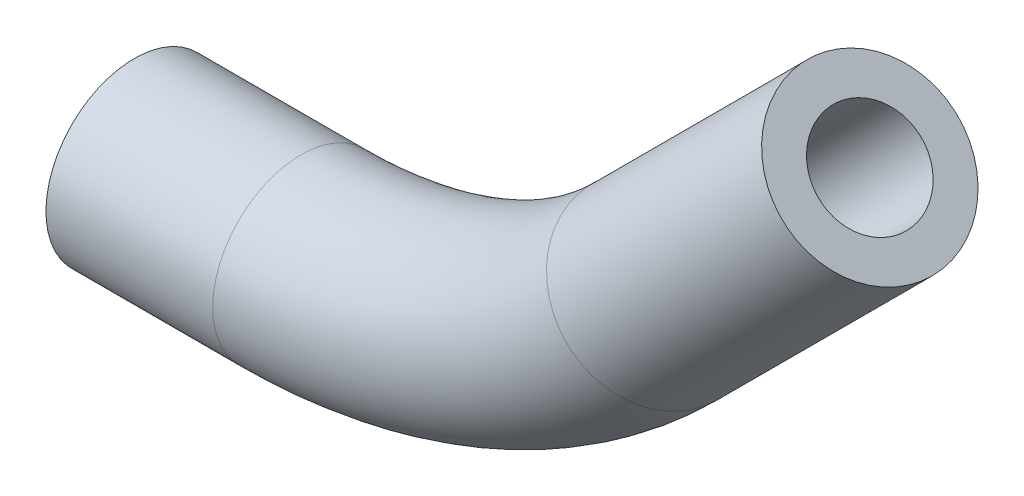
ISO-10303-21;
HEADER;
FILE_DESCRIPTION(('STEP AP214'),'2;1');
FILE_NAME('part.step','',(''),(''),'','','');
FILE_SCHEMA(('AUTOMOTIVE_DESIGN { 1 0 10303 214 1 1 1 1 }'));
ENDSEC;
DATA;
#1=APPLICATION_CONTEXT('core data for automotive mechanical design processes');
#2=APPLICATION_PROTOCOL_DEFINITION('international standard','automotive_design',2000,#1);
#3=PRODUCT_CONTEXT('',#1,'mechanical');
#4=PRODUCT('Part','Part','',(#3));
#5=PRODUCT_RELATED_PRODUCT_CATEGORY('part','',(#4));
#6=PRODUCT_DEFINITION_FORMATION('','',#4);
#7=PRODUCT_DEFINITION_CONTEXT('part definition',#1,'design');
#8=PRODUCT_DEFINITION('design','',#6,#7);
#9=PRODUCT_DEFINITION_SHAPE('','',#8);
#10=(LENGTH_UNIT() NAMED_UNIT(*) SI_UNIT(.MILLI.,.METRE.));
#11=(NAMED_UNIT(*) PLANE_ANGLE_UNIT() SI_UNIT($,.RADIAN.));
#12=(NAMED_UNIT(*) SI_UNIT($,.STERADIAN.) SOLID_ANGLE_UNIT());
#13=UNCERTAINTY_MEASURE_WITH_UNIT(LENGTH_MEASURE(1.E-05),#10,'distance_accuracy_value','');
#14=(GEOMETRIC_REPRESENTATION_CONTEXT(3) GLOBAL_UNCERTAINTY_ASSIGNED_CONTEXT((#13)) GLOBAL_UNIT_ASSIGNED_CONTEXT((#10,
#11,#12)) REPRESENTATION_CONTEXT('',''));
#15=CARTESIAN_POINT('',(0.,0.,0.));
#16=DIRECTION('',(0.,0.,1.));
#17=DIRECTION('',(1.,0.,0.));
#18=AXIS2_PLACEMENT_3D('',#15,#16,#17);
#19=CARTESIAN_POINT('',(0.,0.,0.));
#20=DIRECTION('',(-1.,0.,0.));
#21=DIRECTION('',(0.,-1.,0.));
#22=AXIS2_PLACEMENT_3D('',#19,#20,#21);
#23=PLANE('',#22);
#24=CARTESIAN_POINT('',(0.,0.,0.));
#25=DIRECTION('',(-1.,0.,0.));
#26=DIRECTION('',(0.,-1.,0.));
#27=AXIS2_PLACEMENT_3D('',#24,#25,#26);
#28=CIRCLE('',#27,7.874);
#29=CARTESIAN_POINT('',(0.,-7.87399999999999,0.));
#30=VERTEX_POINT('',#29);
#31=EDGE_CURVE('E75',#30,#30,#28,.T.);
#32=ORIENTED_EDGE('',*,*,#31,.F.);
#33=EDGE_LOOP('',(#32));
#34=FACE_BOUND('',#33,.T.);
#35=CARTESIAN_POINT('',(0.,0.,0.));
#36=DIRECTION('',(-1.,0.,0.));
#37=DIRECTION('',(0.,-1.,0.));
#38=AXIS2_PLACEMENT_3D('',#35,#36,#37);
#39=CIRCLE('',#38,13.462);
#40=CARTESIAN_POINT('',(0.,-13.462,0.));
#41=VERTEX_POINT('',#40);
#42=EDGE_CURVE('E70',#41,#41,#39,.T.);
#43=ORIENTED_EDGE('',*,*,#42,.T.);
#44=EDGE_LOOP('',(#43));
#45=FACE_BOUND('',#44,.T.);
#46=ADVANCED_FACE('F56',(#34,#45),#23,.T.);
#47=CARTESIAN_POINT('',(112.048522617235,55.0854491644053,0.));
#48=DIRECTION('',(-0.707106781186547,-0.707106781186548,0.));
#49=DIRECTION('',(0.707106781186548,-0.707106781186547,0.));
#50=AXIS2_PLACEMENT_3D('',#47,#48,#49);
#51=PLANE('',#50);
#52=CARTESIAN_POINT('',(112.048522617235,55.0854491644053,0.));
#53=DIRECTION('',(-0.707106781186547,-0.707106781186548,0.));
#54=DIRECTION('',(0.707106781186548,-0.707106781186547,0.));
#55=AXIS2_PLACEMENT_3D('',#52,#53,#54);
#56=CIRCLE('',#55,7.874);
#57=CARTESIAN_POINT('',(117.616281412298,49.5176903693424,0.));
#58=VERTEX_POINT('',#57);
#59=EDGE_CURVE('E78',#58,#58,#56,.T.);
#60=ORIENTED_EDGE('',*,*,#59,.T.);
#61=EDGE_LOOP('',(#60));
#62=FACE_BOUND('',#61,.T.);
#63=CARTESIAN_POINT('',(112.048522617235,55.0854491644053,0.));
#64=DIRECTION('',(-0.707106781186547,-0.707106781186548,0.));
#65=DIRECTION('',(0.707106781186548,-0.707106781186547,0.));
#66=AXIS2_PLACEMENT_3D('',#63,#64,#65);
#67=CIRCLE('',#66,13.462);
#68=CARTESIAN_POINT('',(121.567594105568,45.566377676072,0.));
#69=VERTEX_POINT('',#68);
#70=EDGE_CURVE('E11',#69,#69,#67,.T.);
#71=ORIENTED_EDGE('',*,*,#70,.F.);
#72=EDGE_LOOP('',(#71));
#73=FACE_BOUND('',#72,.T.);
#74=ADVANCED_FACE('F88',(#62,#73),#51,.F.);
#75=CARTESIAN_POINT('',(0.,0.,0.));
#76=DIRECTION('',(1.,0.,0.));
#77=DIRECTION('',(0.,0.,-1.));
#78=AXIS2_PLACEMENT_3D('',#75,#76,#77);
#79=CYLINDRICAL_SURFACE('',#78,13.462);
#80=CARTESIAN_POINT('',(25.4,0.,0.));
#81=DIRECTION('',(-1.,0.,0.));
#82=DIRECTION('',(0.,-1.,0.));
#83=AXIS2_PLACEMENT_3D('',#80,#81,#82);
#84=CIRCLE('',#83,13.462);
#85=CARTESIAN_POINT('',(25.4,-13.462,0.));
#86=VERTEX_POINT('',#85);
#87=EDGE_CURVE('E66',#86,#86,#84,.T.);
#88=ORIENTED_EDGE('',*,*,#87,.T.);
#89=EDGE_LOOP('',(#88));
#90=FACE_BOUND('',#89,.T.);
#91=ORIENTED_EDGE('',*,*,#42,.F.);
#92=EDGE_LOOP('',(#91));
#93=FACE_BOUND('',#92,.T.);
#94=ADVANCED_FACE('F114',(#90,#93),#79,.T.);
#95=CARTESIAN_POINT('',(25.4,76.2,0.));
#96=DIRECTION('',(0.,0.,1.));
#97=DIRECTION('',(1.,0.,0.));
#98=AXIS2_PLACEMENT_3D('',#95,#96,#97);
#99=TOROIDAL_SURFACE('',#98,76.2,13.462);
#100=CARTESIAN_POINT('',(79.281536726415,22.3184632735852,0.));
#101=DIRECTION('',(-0.707106781186547,-0.707106781186548,0.));
#102=DIRECTION('',(0.707106781186548,-0.707106781186547,0.));
#103=AXIS2_PLACEMENT_3D('',#100,#101,#102);
#104=CIRCLE('',#103,13.462);
#105=CARTESIAN_POINT('',(88.8006082147483,12.7993917852519,0.));
#106=VERTEX_POINT('',#105);
#107=EDGE_CURVE('E62',#106,#106,#104,.T.);
#108=CARTESIAN_POINT('',(25.4,76.2,0.));
#109=DIRECTION('',(0.,0.,1.));
#110=DIRECTION('',(1.,0.,0.));
#111=AXIS2_PLACEMENT_3D('',#108,#109,#110);
#112=CIRCLE('',#111,89.662);
#113=EDGE_CURVE('',#86,#106,#112,.T.);
#114=ORIENTED_EDGE('',*,*,#87,.F.);
#115=ORIENTED_EDGE('',*,*,#107,.T.);
#116=ORIENTED_EDGE('',*,*,#113,.T.);
#117=ORIENTED_EDGE('',*,*,#113,.F.);
#118=EDGE_LOOP('',(#114,#116,#115,#117));
#119=FACE_BOUND('',#118,.T.);
#120=ADVANCED_FACE('F116',(#119),#99,.T.);
#121=CARTESIAN_POINT('',(79.2815367264149,22.3184632735852,0.));
#122=DIRECTION('',(0.707106781186547,0.707106781186548,0.));
#123=DIRECTION('',(-0.707106781186548,0.707106781186547,0.));
#124=AXIS2_PLACEMENT_3D('',#121,#122,#123);
#125=CYLINDRICAL_SURFACE('',#124,13.462);
#126=ORIENTED_EDGE('',*,*,#70,.T.);
#127=EDGE_LOOP('',(#126));
#128=FACE_BOUND('',#127,.T.);
#129=ORIENTED_EDGE('',*,*,#107,.F.);
#130=EDGE_LOOP('',(#129));
#131=FACE_BOUND('',#130,.T.);
#132=ADVANCED_FACE('F106',(#128,#131),#125,.T.);
#133=CARTESIAN_POINT('',(-1.,0.,0.));
#134=DIRECTION('',(1.,0.,0.));
#135=DIRECTION('',(0.,0.,-1.));
#136=AXIS2_PLACEMENT_3D('',#133,#134,#135);
#137=CYLINDRICAL_SURFACE('',#136,7.874);
#138=CARTESIAN_POINT('',(25.4,0.,0.));
#139=DIRECTION('',(-1.,0.,0.));
#140=DIRECTION('',(0.,-1.,0.));
#141=AXIS2_PLACEMENT_3D('',#138,#139,#140);
#142=CIRCLE('',#141,7.874);
#143=CARTESIAN_POINT('',(25.4,-7.87399999999995,0.));
#144=VERTEX_POINT('',#143);
#145=EDGE_CURVE('E79',#144,#144,#142,.T.);
#146=ORIENTED_EDGE('',*,*,#145,.F.);
#147=EDGE_LOOP('',(#146));
#148=FACE_BOUND('',#147,.T.);
#149=ORIENTED_EDGE('',*,*,#31,.T.);
#150=EDGE_LOOP('',(#149));
#151=FACE_BOUND('',#150,.T.);
#152=ADVANCED_FACE('F96',(#148,#151),#137,.F.);
#153=CARTESIAN_POINT('',(25.4,76.2,0.));
#154=DIRECTION('',(0.,0.,1.));
#155=DIRECTION('',(1.,0.,0.));
#156=AXIS2_PLACEMENT_3D('',#153,#154,#155);
#157=TOROIDAL_SURFACE('',#156,76.2,7.874);
#158=CARTESIAN_POINT('',(79.2815367264149,22.3184632735852,0.));
#159=DIRECTION('',(-0.707106781186547,-0.707106781186548,0.));
#160=DIRECTION('',(0.707106781186548,-0.707106781186547,0.));
#161=AXIS2_PLACEMENT_3D('',#158,#159,#160);
#162=CIRCLE('',#161,7.874);
#163=CARTESIAN_POINT('',(84.8492955214778,16.7507044785223,0.));
#164=VERTEX_POINT('',#163);
#165=EDGE_CURVE('E82',#164,#164,#162,.T.);
#166=CARTESIAN_POINT('',(25.4,76.2,0.));
#167=DIRECTION('',(0.,0.,1.));
#168=DIRECTION('',(1.,0.,0.));
#169=AXIS2_PLACEMENT_3D('',#166,#167,#168);
#170=CIRCLE('',#169,84.074);
#171=EDGE_CURVE('',#144,#164,#170,.T.);
#172=ORIENTED_EDGE('',*,*,#145,.T.);
#173=ORIENTED_EDGE('',*,*,#165,.F.);
#174=ORIENTED_EDGE('',*,*,#171,.T.);
#175=ORIENTED_EDGE('',*,*,#171,.F.);
#176=EDGE_LOOP('',(#172,#174,#173,#175));
#177=FACE_BOUND('',#176,.T.);
#178=ADVANCED_FACE('F94',(#177),#157,.F.);
#179=CARTESIAN_POINT('',(79.2815367264149,22.3184632735852,0.));
#180=DIRECTION('',(0.707106781186547,0.707106781186548,0.));
#181=DIRECTION('',(-0.707106781186548,0.707106781186547,0.));
#182=AXIS2_PLACEMENT_3D('',#179,#180,#181);
#183=CYLINDRICAL_SURFACE('',#182,7.874);
#184=ORIENTED_EDGE('',*,*,#59,.F.);
#185=EDGE_LOOP('',(#184));
#186=FACE_BOUND('',#185,.T.);
#187=ORIENTED_EDGE('',*,*,#165,.T.);
#188=EDGE_LOOP('',(#187));
#189=FACE_BOUND('',#188,.T.);
#190=ADVANCED_FACE('F91',(#186,#189),#183,.F.);
#191=CLOSED_SHELL('',(#46,#74,#94,#120,#132,#152,#178,#190));
#192=MANIFOLD_SOLID_BREP('B2',#191);
#193=ADVANCED_BREP_SHAPE_REPRESENTATION('',(#18,#192),#14);
#194=SHAPE_DEFINITION_REPRESENTATION(#9,#193);
ENDSEC;
END-ISO-10303-21;
